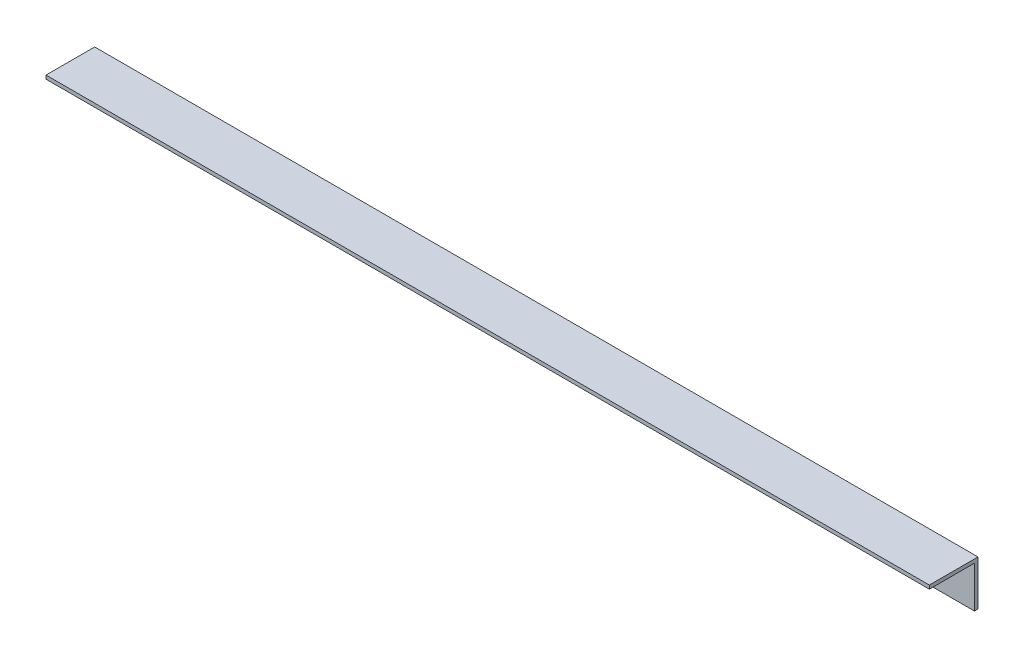
ISO-10303-21;
HEADER;
FILE_DESCRIPTION(('STEP AP214'),'2;1');
FILE_NAME('part.step','',(''),(''),'','','');
FILE_SCHEMA(('AUTOMOTIVE_DESIGN { 1 0 10303 214 1 1 1 1 }'));
ENDSEC;
DATA;
#1=APPLICATION_CONTEXT('core data for automotive mechanical design processes');
#2=APPLICATION_PROTOCOL_DEFINITION('international standard','automotive_design',2000,#1);
#3=PRODUCT_CONTEXT('',#1,'mechanical');
#4=PRODUCT('Part','Part','',(#3));
#5=PRODUCT_RELATED_PRODUCT_CATEGORY('part','',(#4));
#6=PRODUCT_DEFINITION_FORMATION('','',#4);
#7=PRODUCT_DEFINITION_CONTEXT('part definition',#1,'design');
#8=PRODUCT_DEFINITION('design','',#6,#7);
#9=PRODUCT_DEFINITION_SHAPE('','',#8);
#10=(LENGTH_UNIT() NAMED_UNIT(*) SI_UNIT(.MILLI.,.METRE.));
#11=(NAMED_UNIT(*) PLANE_ANGLE_UNIT() SI_UNIT($,.RADIAN.));
#12=(NAMED_UNIT(*) SI_UNIT($,.STERADIAN.) SOLID_ANGLE_UNIT());
#13=UNCERTAINTY_MEASURE_WITH_UNIT(LENGTH_MEASURE(1.E-05),#10,'distance_accuracy_value','');
#14=(GEOMETRIC_REPRESENTATION_CONTEXT(3) GLOBAL_UNCERTAINTY_ASSIGNED_CONTEXT((#13)) GLOBAL_UNIT_ASSIGNED_CONTEXT((#10,
#11,#12)) REPRESENTATION_CONTEXT('',''));
#15=CARTESIAN_POINT('',(0.,0.,0.));
#16=DIRECTION('',(0.,0.,1.));
#17=DIRECTION('',(1.,0.,0.));
#18=AXIS2_PLACEMENT_3D('',#15,#16,#17);
#19=CARTESIAN_POINT('',(-980.,94.5121151826794,8.));
#20=DIRECTION('',(1.,0.,0.));
#21=DIRECTION('',(0.,0.,-1.));
#22=AXIS2_PLACEMENT_3D('',#19,#20,#21);
#23=PLANE('',#22);
#24=DIRECTION('',(0.,-1.,0.));
#25=VECTOR('',#24,1.);
#26=CARTESIAN_POINT('',(-980.,94.5121151826794,0.));
#27=LINE('',#26,#25);
#28=CARTESIAN_POINT('',(-980.,94.5121151826794,0.));
#29=VERTEX_POINT('',#28);
#30=CARTESIAN_POINT('',(-980.,-5.48788481732075,0.));
#31=VERTEX_POINT('',#30);
#32=EDGE_CURVE('E92',#29,#31,#27,.T.);
#33=ORIENTED_EDGE('',*,*,#32,.T.);
#34=DIRECTION('',(0.,0.,-1.));
#35=VECTOR('',#34,1.);
#36=CARTESIAN_POINT('',(-980.,-5.48788481732075,8.));
#37=LINE('',#36,#35);
#38=CARTESIAN_POINT('',(-980.,-5.48788481732075,8.));
#39=VERTEX_POINT('',#38);
#40=EDGE_CURVE('E11',#39,#31,#37,.T.);
#41=ORIENTED_EDGE('',*,*,#40,.F.);
#42=DIRECTION('',(0.,-1.,0.));
#43=VECTOR('',#42,1.);
#44=CARTESIAN_POINT('',(-980.,94.5121151826794,8.));
#45=LINE('',#44,#43);
#46=CARTESIAN_POINT('',(-980.,86.5121151826793,8.));
#47=VERTEX_POINT('',#46);
#48=EDGE_CURVE('E85',#47,#39,#45,.T.);
#49=ORIENTED_EDGE('',*,*,#48,.F.);
#50=DIRECTION('',(0.,0.,-1.));
#51=VECTOR('',#50,1.);
#52=CARTESIAN_POINT('',(-980.,86.5121151826793,108.));
#53=LINE('',#52,#51);
#54=CARTESIAN_POINT('',(-980.,86.5121151826793,108.));
#55=VERTEX_POINT('',#54);
#56=EDGE_CURVE('E100',#55,#47,#53,.T.);
#57=ORIENTED_EDGE('',*,*,#56,.F.);
#58=DIRECTION('',(0.,-1.,0.));
#59=VECTOR('',#58,1.);
#60=CARTESIAN_POINT('',(-980.,94.5121151826794,108.));
#61=LINE('',#60,#59);
#62=CARTESIAN_POINT('',(-980.,94.5121151826794,108.));
#63=VERTEX_POINT('',#62);
#64=EDGE_CURVE('E95',#63,#55,#61,.T.);
#65=ORIENTED_EDGE('',*,*,#64,.F.);
#66=DIRECTION('',(0.,0.,-1.));
#67=VECTOR('',#66,1.);
#68=CARTESIAN_POINT('',(-980.,94.5121151826794,8.));
#69=LINE('',#68,#67);
#70=EDGE_CURVE('E78',#63,#29,#69,.T.);
#71=ORIENTED_EDGE('',*,*,#70,.T.);
#72=EDGE_LOOP('',(#33,#41,#49,#57,#65,#71));
#73=FACE_BOUND('',#72,.T.);
#74=ADVANCED_FACE('F32',(#73),#23,.F.);
#75=CARTESIAN_POINT('',(-980.,-5.48788481732075,8.));
#76=DIRECTION('',(0.,1.,0.));
#77=DIRECTION('',(0.,0.,1.));
#78=AXIS2_PLACEMENT_3D('',#75,#76,#77);
#79=PLANE('',#78);
#80=DIRECTION('',(1.,0.,0.));
#81=VECTOR('',#80,1.);
#82=CARTESIAN_POINT('',(-980.,-5.48788481732075,0.));
#83=LINE('',#82,#81);
#84=CARTESIAN_POINT('',(980.,-5.48788481732075,0.));
#85=VERTEX_POINT('',#84);
#86=EDGE_CURVE('E99',#31,#85,#83,.T.);
#87=ORIENTED_EDGE('',*,*,#86,.T.);
#88=DIRECTION('',(0.,0.,-1.));
#89=VECTOR('',#88,1.);
#90=CARTESIAN_POINT('',(980.,-5.48788481732075,8.));
#91=LINE('',#90,#89);
#92=CARTESIAN_POINT('',(980.,-5.48788481732075,8.));
#93=VERTEX_POINT('',#92);
#94=EDGE_CURVE('E40',#93,#85,#91,.T.);
#95=ORIENTED_EDGE('',*,*,#94,.F.);
#96=DIRECTION('',(1.,0.,0.));
#97=VECTOR('',#96,1.);
#98=CARTESIAN_POINT('',(-980.,-5.48788481732075,8.));
#99=LINE('',#98,#97);
#100=EDGE_CURVE('E54',#39,#93,#99,.T.);
#101=ORIENTED_EDGE('',*,*,#100,.F.);
#102=ORIENTED_EDGE('',*,*,#40,.T.);
#103=EDGE_LOOP('',(#87,#95,#101,#102));
#104=FACE_BOUND('',#103,.T.);
#105=ADVANCED_FACE('F148',(#104),#79,.F.);
#106=CARTESIAN_POINT('',(980.,94.5121151826794,8.));
#107=DIRECTION('',(-1.,0.,0.));
#108=DIRECTION('',(0.,0.,1.));
#109=AXIS2_PLACEMENT_3D('',#106,#107,#108);
#110=PLANE('',#109);
#111=DIRECTION('',(0.,1.,0.));
#112=VECTOR('',#111,1.);
#113=CARTESIAN_POINT('',(980.,94.5121151826794,0.));
#114=LINE('',#113,#112);
#115=CARTESIAN_POINT('',(980.,94.5121151826794,0.));
#116=VERTEX_POINT('',#115);
#117=EDGE_CURVE('E86',#85,#116,#114,.T.);
#118=ORIENTED_EDGE('',*,*,#117,.T.);
#119=DIRECTION('',(0.,0.,-1.));
#120=VECTOR('',#119,1.);
#121=CARTESIAN_POINT('',(980.,94.5121151826794,8.));
#122=LINE('',#121,#120);
#123=CARTESIAN_POINT('',(980.,94.5121151826794,108.));
#124=VERTEX_POINT('',#123);
#125=EDGE_CURVE('E81',#124,#116,#122,.T.);
#126=ORIENTED_EDGE('',*,*,#125,.F.);
#127=DIRECTION('',(0.,1.,0.));
#128=VECTOR('',#127,1.);
#129=CARTESIAN_POINT('',(980.,94.5121151826794,108.));
#130=LINE('',#129,#128);
#131=CARTESIAN_POINT('',(980.,86.5121151826793,108.));
#132=VERTEX_POINT('',#131);
#133=EDGE_CURVE('E134',#132,#124,#130,.T.);
#134=ORIENTED_EDGE('',*,*,#133,.F.);
#135=DIRECTION('',(0.,0.,-1.));
#136=VECTOR('',#135,1.);
#137=CARTESIAN_POINT('',(980.,86.5121151826793,108.));
#138=LINE('',#137,#136);
#139=CARTESIAN_POINT('',(980.,86.5121151826793,8.));
#140=VERTEX_POINT('',#139);
#141=EDGE_CURVE('E104',#132,#140,#138,.T.);
#142=ORIENTED_EDGE('',*,*,#141,.T.);
#143=DIRECTION('',(0.,1.,0.));
#144=VECTOR('',#143,1.);
#145=CARTESIAN_POINT('',(980.,94.5121151826794,8.));
#146=LINE('',#145,#144);
#147=EDGE_CURVE('E96',#93,#140,#146,.T.);
#148=ORIENTED_EDGE('',*,*,#147,.F.);
#149=ORIENTED_EDGE('',*,*,#94,.T.);
#150=EDGE_LOOP('',(#118,#126,#134,#142,#148,#149));
#151=FACE_BOUND('',#150,.T.);
#152=ADVANCED_FACE('F132',(#151),#110,.F.);
#153=CARTESIAN_POINT('',(-980.,94.5121151826794,8.));
#154=DIRECTION('',(0.,-1.,0.));
#155=DIRECTION('',(0.,0.,-1.));
#156=AXIS2_PLACEMENT_3D('',#153,#154,#155);
#157=PLANE('',#156);
#158=DIRECTION('',(-1.,0.,0.));
#159=VECTOR('',#158,1.);
#160=CARTESIAN_POINT('',(-980.,94.5121151826794,0.));
#161=LINE('',#160,#159);
#162=EDGE_CURVE('E74',#116,#29,#161,.T.);
#163=ORIENTED_EDGE('',*,*,#162,.T.);
#164=ORIENTED_EDGE('',*,*,#70,.F.);
#165=DIRECTION('',(-1.,0.,0.));
#166=VECTOR('',#165,1.);
#167=CARTESIAN_POINT('',(-980.,94.5121151826794,108.));
#168=LINE('',#167,#166);
#169=EDGE_CURVE('E135',#124,#63,#168,.T.);
#170=ORIENTED_EDGE('',*,*,#169,.F.);
#171=ORIENTED_EDGE('',*,*,#125,.T.);
#172=EDGE_LOOP('',(#163,#164,#170,#171));
#173=FACE_BOUND('',#172,.T.);
#174=ADVANCED_FACE('F76',(#173),#157,.F.);
#175=CARTESIAN_POINT('',(-980.,-5.48788481732075,8.));
#176=DIRECTION('',(0.,0.,1.));
#177=DIRECTION('',(1.,0.,0.));
#178=AXIS2_PLACEMENT_3D('',#175,#176,#177);
#179=PLANE('',#178);
#180=DIRECTION('',(1.,0.,0.));
#181=VECTOR('',#180,1.);
#182=CARTESIAN_POINT('',(-980.,86.5121151826793,8.));
#183=LINE('',#182,#181);
#184=EDGE_CURVE('E48',#47,#140,#183,.T.);
#185=ORIENTED_EDGE('',*,*,#184,.F.);
#186=ORIENTED_EDGE('',*,*,#48,.T.);
#187=ORIENTED_EDGE('',*,*,#100,.T.);
#188=ORIENTED_EDGE('',*,*,#147,.T.);
#189=EDGE_LOOP('',(#185,#186,#187,#188));
#190=FACE_BOUND('',#189,.T.);
#191=ADVANCED_FACE('F122',(#190),#179,.T.);
#192=CARTESIAN_POINT('',(-980.,-5.48788481732075,0.));
#193=DIRECTION('',(0.,0.,1.));
#194=DIRECTION('',(1.,0.,0.));
#195=AXIS2_PLACEMENT_3D('',#192,#193,#194);
#196=PLANE('',#195);
#197=ORIENTED_EDGE('',*,*,#32,.F.);
#198=ORIENTED_EDGE('',*,*,#162,.F.);
#199=ORIENTED_EDGE('',*,*,#117,.F.);
#200=ORIENTED_EDGE('',*,*,#86,.F.);
#201=EDGE_LOOP('',(#197,#198,#199,#200));
#202=FACE_BOUND('',#201,.T.);
#203=ADVANCED_FACE('F98',(#202),#196,.F.);
#204=CARTESIAN_POINT('',(-980.,86.5121151826793,108.));
#205=DIRECTION('',(0.,1.,0.));
#206=DIRECTION('',(0.,0.,1.));
#207=AXIS2_PLACEMENT_3D('',#204,#205,#206);
#208=PLANE('',#207);
#209=ORIENTED_EDGE('',*,*,#184,.T.);
#210=ORIENTED_EDGE('',*,*,#141,.F.);
#211=DIRECTION('',(1.,0.,0.));
#212=VECTOR('',#211,1.);
#213=CARTESIAN_POINT('',(-980.,86.5121151826793,108.));
#214=LINE('',#213,#212);
#215=EDGE_CURVE('E140',#55,#132,#214,.T.);
#216=ORIENTED_EDGE('',*,*,#215,.F.);
#217=ORIENTED_EDGE('',*,*,#56,.T.);
#218=EDGE_LOOP('',(#209,#210,#216,#217));
#219=FACE_BOUND('',#218,.T.);
#220=ADVANCED_FACE('F128',(#219),#208,.F.);
#221=CARTESIAN_POINT('',(-980.,86.5121151826793,108.));
#222=DIRECTION('',(0.,0.,1.));
#223=DIRECTION('',(1.,0.,0.));
#224=AXIS2_PLACEMENT_3D('',#221,#222,#223);
#225=PLANE('',#224);
#226=ORIENTED_EDGE('',*,*,#64,.T.);
#227=ORIENTED_EDGE('',*,*,#215,.T.);
#228=ORIENTED_EDGE('',*,*,#133,.T.);
#229=ORIENTED_EDGE('',*,*,#169,.T.);
#230=EDGE_LOOP('',(#226,#227,#228,#229));
#231=FACE_BOUND('',#230,.T.);
#232=ADVANCED_FACE('F145',(#231),#225,.T.);
#233=CLOSED_SHELL('',(#74,#105,#152,#174,#191,#203,#220,#232));
#234=MANIFOLD_SOLID_BREP('B2',#233);
#235=ADVANCED_BREP_SHAPE_REPRESENTATION('',(#18,#234),#14);
#236=SHAPE_DEFINITION_REPRESENTATION(#9,#235);
ENDSEC;
END-ISO-10303-21;
